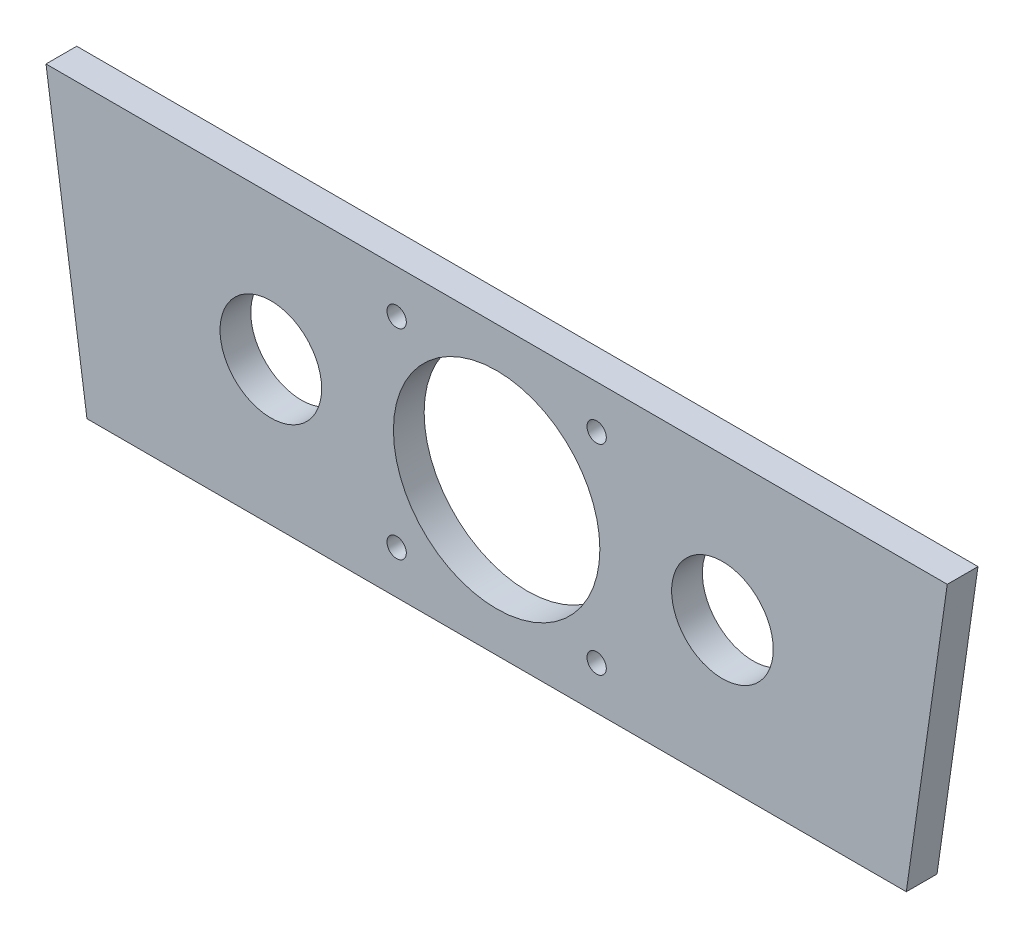
ISO-10303-21;
HEADER;
FILE_DESCRIPTION(('STEP AP214'),'2;1');
FILE_NAME('part.step','',(''),(''),'','','');
FILE_SCHEMA(('AUTOMOTIVE_DESIGN { 1 0 10303 214 1 1 1 1 }'));
ENDSEC;
DATA;
#1=APPLICATION_CONTEXT('core data for automotive mechanical design processes');
#2=APPLICATION_PROTOCOL_DEFINITION('international standard','automotive_design',2000,#1);
#3=PRODUCT_CONTEXT('',#1,'mechanical');
#4=PRODUCT('Part','Part','',(#3));
#5=PRODUCT_RELATED_PRODUCT_CATEGORY('part','',(#4));
#6=PRODUCT_DEFINITION_FORMATION('','',#4);
#7=PRODUCT_DEFINITION_CONTEXT('part definition',#1,'design');
#8=PRODUCT_DEFINITION('design','',#6,#7);
#9=PRODUCT_DEFINITION_SHAPE('','',#8);
#10=(LENGTH_UNIT() NAMED_UNIT(*) SI_UNIT(.MILLI.,.METRE.));
#11=(NAMED_UNIT(*) PLANE_ANGLE_UNIT() SI_UNIT($,.RADIAN.));
#12=(NAMED_UNIT(*) SI_UNIT($,.STERADIAN.) SOLID_ANGLE_UNIT());
#13=UNCERTAINTY_MEASURE_WITH_UNIT(LENGTH_MEASURE(1.E-05),#10,'distance_accuracy_value','');
#14=(GEOMETRIC_REPRESENTATION_CONTEXT(3) GLOBAL_UNCERTAINTY_ASSIGNED_CONTEXT((#13)) GLOBAL_UNIT_ASSIGNED_CONTEXT((#10,
#11,#12)) REPRESENTATION_CONTEXT('',''));
#15=CARTESIAN_POINT('',(0.,0.,0.));
#16=DIRECTION('',(0.,0.,1.));
#17=DIRECTION('',(1.,0.,0.));
#18=AXIS2_PLACEMENT_3D('',#15,#16,#17);
#19=CARTESIAN_POINT('',(0.,50.8,4.7625));
#20=DIRECTION('',(0.,1.,0.));
#21=DIRECTION('',(0.,0.,1.));
#22=AXIS2_PLACEMENT_3D('',#19,#20,#21);
#23=PLANE('',#22);
#24=DIRECTION('',(1.,0.,0.));
#25=VECTOR('',#24,1.);
#26=CARTESIAN_POINT('',(0.,50.8,0.));
#27=LINE('',#26,#25);
#28=CARTESIAN_POINT('',(6.34999999999998,50.8,0.));
#29=VERTEX_POINT('',#28);
#30=CARTESIAN_POINT('',(146.05,50.8,0.));
#31=VERTEX_POINT('',#30);
#32=EDGE_CURVE('E40',#29,#31,#27,.T.);
#33=ORIENTED_EDGE('',*,*,#32,.F.);
#34=DIRECTION('',(0.,0.,-1.));
#35=VECTOR('',#34,1.);
#36=CARTESIAN_POINT('',(6.34999999999998,50.8,165.406205136554));
#37=LINE('',#36,#35);
#38=CARTESIAN_POINT('',(6.34999999999998,50.8,4.7625));
#39=VERTEX_POINT('',#38);
#40=EDGE_CURVE('E92',#39,#29,#37,.T.);
#41=ORIENTED_EDGE('',*,*,#40,.F.);
#42=DIRECTION('',(-1.,0.,0.));
#43=VECTOR('',#42,1.);
#44=CARTESIAN_POINT('',(0.,50.8,4.7625));
#45=LINE('',#44,#43);
#46=CARTESIAN_POINT('',(146.05,50.8,4.7625));
#47=VERTEX_POINT('',#46);
#48=EDGE_CURVE('E11',#47,#39,#45,.T.);
#49=ORIENTED_EDGE('',*,*,#48,.F.);
#50=DIRECTION('',(0.,0.,-1.));
#51=VECTOR('',#50,1.);
#52=CARTESIAN_POINT('',(146.05,50.8,165.406205136554));
#53=LINE('',#52,#51);
#54=EDGE_CURVE('E75',#47,#31,#53,.T.);
#55=ORIENTED_EDGE('',*,*,#54,.T.);
#56=EDGE_LOOP('',(#33,#41,#49,#55));
#57=FACE_BOUND('',#56,.T.);
#58=ADVANCED_FACE('F37',(#57),#23,.T.);
#59=CARTESIAN_POINT('',(0.,0.,4.7625));
#60=DIRECTION('',(0.,0.,1.));
#61=DIRECTION('',(1.,0.,0.));
#62=AXIS2_PLACEMENT_3D('',#59,#60,#61);
#63=PLANE('',#62);
#64=CARTESIAN_POINT('',(91.7,13.075,4.7625));
#65=DIRECTION('',(0.,0.,1.));
#66=DIRECTION('',(1.,0.,0.));
#67=AXIS2_PLACEMENT_3D('',#64,#65,#66);
#68=CIRCLE('',#67,1.50000000000001);
#69=CARTESIAN_POINT('',(93.2,13.075,4.7625));
#70=VERTEX_POINT('',#69);
#71=EDGE_CURVE('E130',#70,#70,#68,.F.);
#72=ORIENTED_EDGE('',*,*,#71,.T.);
#73=EDGE_LOOP('',(#72));
#74=FACE_BOUND('',#73,.T.);
#75=CARTESIAN_POINT('',(60.7,13.075,4.7625));
#76=DIRECTION('',(0.,0.,1.));
#77=DIRECTION('',(1.,0.,0.));
#78=AXIS2_PLACEMENT_3D('',#75,#76,#77);
#79=CIRCLE('',#78,1.5);
#80=CARTESIAN_POINT('',(62.2,13.075,4.7625));
#81=VERTEX_POINT('',#80);
#82=EDGE_CURVE('E122',#81,#81,#79,.T.);
#83=ORIENTED_EDGE('',*,*,#82,.F.);
#84=EDGE_LOOP('',(#83));
#85=FACE_BOUND('',#84,.T.);
#86=CARTESIAN_POINT('',(60.7,44.075,4.7625));
#87=DIRECTION('',(0.,0.,1.));
#88=DIRECTION('',(1.,0.,0.));
#89=AXIS2_PLACEMENT_3D('',#86,#87,#88);
#90=CIRCLE('',#89,1.5);
#91=CARTESIAN_POINT('',(62.2,44.075,4.7625));
#92=VERTEX_POINT('',#91);
#93=EDGE_CURVE('E133',#92,#92,#90,.F.);
#94=ORIENTED_EDGE('',*,*,#93,.T.);
#95=EDGE_LOOP('',(#94));
#96=FACE_BOUND('',#95,.T.);
#97=CARTESIAN_POINT('',(41.2,28.575,4.7625));
#98=DIRECTION('',(0.,0.,1.));
#99=DIRECTION('',(1.,0.,0.));
#100=AXIS2_PLACEMENT_3D('',#97,#98,#99);
#101=CIRCLE('',#100,7.874);
#102=CARTESIAN_POINT('',(49.074,28.575,4.7625));
#103=VERTEX_POINT('',#102);
#104=EDGE_CURVE('E112',#103,#103,#101,.F.);
#105=ORIENTED_EDGE('',*,*,#104,.T.);
#106=EDGE_LOOP('',(#105));
#107=FACE_BOUND('',#106,.T.);
#108=CARTESIAN_POINT('',(91.7,44.075,4.7625));
#109=DIRECTION('',(0.,0.,1.));
#110=DIRECTION('',(1.,0.,0.));
#111=AXIS2_PLACEMENT_3D('',#108,#109,#110);
#112=CIRCLE('',#111,1.50000000000001);
#113=CARTESIAN_POINT('',(93.2,44.075,4.7625));
#114=VERTEX_POINT('',#113);
#115=EDGE_CURVE('E123',#114,#114,#112,.T.);
#116=ORIENTED_EDGE('',*,*,#115,.F.);
#117=EDGE_LOOP('',(#116));
#118=FACE_BOUND('',#117,.T.);
#119=CARTESIAN_POINT('',(76.2,28.575,4.7625));
#120=DIRECTION('',(0.,0.,1.));
#121=DIRECTION('',(1.,0.,0.));
#122=AXIS2_PLACEMENT_3D('',#119,#120,#121);
#123=CIRCLE('',#122,16.);
#124=CARTESIAN_POINT('',(92.2,28.575,4.7625));
#125=VERTEX_POINT('',#124);
#126=EDGE_CURVE('E140',#125,#125,#123,.T.);
#127=ORIENTED_EDGE('',*,*,#126,.F.);
#128=EDGE_LOOP('',(#127));
#129=FACE_BOUND('',#128,.T.);
#130=CARTESIAN_POINT('',(111.2,28.575,4.7625));
#131=DIRECTION('',(0.,0.,1.));
#132=DIRECTION('',(1.,0.,0.));
#133=AXIS2_PLACEMENT_3D('',#130,#131,#132);
#134=CIRCLE('',#133,7.874);
#135=CARTESIAN_POINT('',(119.074,28.575,4.7625));
#136=VERTEX_POINT('',#135);
#137=EDGE_CURVE('E83',#136,#136,#134,.T.);
#138=ORIENTED_EDGE('',*,*,#137,.F.);
#139=EDGE_LOOP('',(#138));
#140=FACE_BOUND('',#139,.T.);
#141=ORIENTED_EDGE('',*,*,#48,.T.);
#142=DIRECTION('',(-0.14142135623731,0.989949493661166,0.));
#143=VECTOR('',#142,1.);
#144=CARTESIAN_POINT('',(13.335,1.90500000000001,4.7625));
#145=LINE('',#144,#143);
#146=CARTESIAN_POINT('',(12.7,6.34999999999999,4.7625));
#147=VERTEX_POINT('',#146);
#148=EDGE_CURVE('E100',#147,#39,#145,.T.);
#149=ORIENTED_EDGE('',*,*,#148,.F.);
#150=DIRECTION('',(-1.,0.,0.));
#151=VECTOR('',#150,1.);
#152=CARTESIAN_POINT('',(0.,6.34999999999999,4.7625));
#153=LINE('',#152,#151);
#154=CARTESIAN_POINT('',(139.7,6.34999999999999,4.7625));
#155=VERTEX_POINT('',#154);
#156=EDGE_CURVE('E89',#155,#147,#153,.T.);
#157=ORIENTED_EDGE('',*,*,#156,.F.);
#158=DIRECTION('',(0.14142135623731,0.989949493661166,0.));
#159=VECTOR('',#158,1.);
#160=CARTESIAN_POINT('',(136.017,-19.4310000000001,4.7625));
#161=LINE('',#160,#159);
#162=EDGE_CURVE('E78',#155,#47,#161,.T.);
#163=ORIENTED_EDGE('',*,*,#162,.T.);
#164=EDGE_LOOP('',(#141,#149,#157,#163));
#165=FACE_BOUND('',#164,.T.);
#166=ADVANCED_FACE('F87',(#74,#85,#96,#107,#118,#129,#140,#165),#63,.T.);
#167=CARTESIAN_POINT('',(0.,0.,0.));
#168=DIRECTION('',(0.,0.,1.));
#169=DIRECTION('',(1.,0.,0.));
#170=AXIS2_PLACEMENT_3D('',#167,#168,#169);
#171=PLANE('',#170);
#172=CARTESIAN_POINT('',(41.2,28.575,0.));
#173=DIRECTION('',(0.,0.,1.));
#174=DIRECTION('',(1.,0.,0.));
#175=AXIS2_PLACEMENT_3D('',#172,#173,#174);
#176=CIRCLE('',#175,7.874);
#177=CARTESIAN_POINT('',(49.074,28.575,0.));
#178=VERTEX_POINT('',#177);
#179=EDGE_CURVE('E104',#178,#178,#176,.F.);
#180=ORIENTED_EDGE('',*,*,#179,.F.);
#181=EDGE_LOOP('',(#180));
#182=FACE_BOUND('',#181,.T.);
#183=CARTESIAN_POINT('',(111.2,28.575,0.));
#184=DIRECTION('',(0.,0.,1.));
#185=DIRECTION('',(1.,0.,0.));
#186=AXIS2_PLACEMENT_3D('',#183,#184,#185);
#187=CIRCLE('',#186,7.874);
#188=CARTESIAN_POINT('',(119.074,28.575,0.));
#189=VERTEX_POINT('',#188);
#190=EDGE_CURVE('E109',#189,#189,#187,.T.);
#191=ORIENTED_EDGE('',*,*,#190,.T.);
#192=EDGE_LOOP('',(#191));
#193=FACE_BOUND('',#192,.T.);
#194=CARTESIAN_POINT('',(76.2,28.575,0.));
#195=DIRECTION('',(0.,0.,1.));
#196=DIRECTION('',(1.,0.,0.));
#197=AXIS2_PLACEMENT_3D('',#194,#195,#196);
#198=CIRCLE('',#197,16.);
#199=CARTESIAN_POINT('',(92.2,28.575,0.));
#200=VERTEX_POINT('',#199);
#201=EDGE_CURVE('E113',#200,#200,#198,.T.);
#202=ORIENTED_EDGE('',*,*,#201,.T.);
#203=EDGE_LOOP('',(#202));
#204=FACE_BOUND('',#203,.T.);
#205=CARTESIAN_POINT('',(91.7,44.075,0.));
#206=DIRECTION('',(0.,0.,1.));
#207=DIRECTION('',(1.,0.,0.));
#208=AXIS2_PLACEMENT_3D('',#205,#206,#207);
#209=CIRCLE('',#208,1.50000000000001);
#210=CARTESIAN_POINT('',(93.2,44.075,0.));
#211=VERTEX_POINT('',#210);
#212=EDGE_CURVE('E116',#211,#211,#209,.T.);
#213=ORIENTED_EDGE('',*,*,#212,.T.);
#214=EDGE_LOOP('',(#213));
#215=FACE_BOUND('',#214,.T.);
#216=CARTESIAN_POINT('',(91.7,13.075,0.));
#217=DIRECTION('',(0.,0.,1.));
#218=DIRECTION('',(1.,0.,0.));
#219=AXIS2_PLACEMENT_3D('',#216,#217,#218);
#220=CIRCLE('',#219,1.50000000000001);
#221=CARTESIAN_POINT('',(93.2,13.075,0.));
#222=VERTEX_POINT('',#221);
#223=EDGE_CURVE('E119',#222,#222,#220,.F.);
#224=ORIENTED_EDGE('',*,*,#223,.F.);
#225=EDGE_LOOP('',(#224));
#226=FACE_BOUND('',#225,.T.);
#227=CARTESIAN_POINT('',(60.7,13.075,0.));
#228=DIRECTION('',(0.,0.,1.));
#229=DIRECTION('',(1.,0.,0.));
#230=AXIS2_PLACEMENT_3D('',#227,#228,#229);
#231=CIRCLE('',#230,1.5);
#232=CARTESIAN_POINT('',(62.2,13.075,0.));
#233=VERTEX_POINT('',#232);
#234=EDGE_CURVE('E107',#233,#233,#231,.T.);
#235=ORIENTED_EDGE('',*,*,#234,.T.);
#236=EDGE_LOOP('',(#235));
#237=FACE_BOUND('',#236,.T.);
#238=CARTESIAN_POINT('',(60.7,44.075,0.));
#239=DIRECTION('',(0.,0.,1.));
#240=DIRECTION('',(1.,0.,0.));
#241=AXIS2_PLACEMENT_3D('',#238,#239,#240);
#242=CIRCLE('',#241,1.5);
#243=CARTESIAN_POINT('',(62.2,44.075,0.));
#244=VERTEX_POINT('',#243);
#245=EDGE_CURVE('E108',#244,#244,#242,.F.);
#246=ORIENTED_EDGE('',*,*,#245,.F.);
#247=EDGE_LOOP('',(#246));
#248=FACE_BOUND('',#247,.T.);
#249=DIRECTION('',(-0.14142135623731,0.989949493661167,0.));
#250=VECTOR('',#249,1.);
#251=CARTESIAN_POINT('',(13.335,1.90500000000001,0.));
#252=LINE('',#251,#250);
#253=CARTESIAN_POINT('',(12.7,6.34999999999999,0.));
#254=VERTEX_POINT('',#253);
#255=EDGE_CURVE('E98',#254,#29,#252,.T.);
#256=ORIENTED_EDGE('',*,*,#255,.T.);
#257=ORIENTED_EDGE('',*,*,#32,.T.);
#258=DIRECTION('',(0.14142135623731,0.989949493661167,0.));
#259=VECTOR('',#258,1.);
#260=CARTESIAN_POINT('',(136.017,-19.4310000000001,0.));
#261=LINE('',#260,#259);
#262=CARTESIAN_POINT('',(139.7,6.34999999999998,0.));
#263=VERTEX_POINT('',#262);
#264=EDGE_CURVE('E59',#263,#31,#261,.T.);
#265=ORIENTED_EDGE('',*,*,#264,.F.);
#266=DIRECTION('',(-1.,0.,0.));
#267=VECTOR('',#266,1.);
#268=CARTESIAN_POINT('',(0.,6.34999999999999,0.));
#269=LINE('',#268,#267);
#270=EDGE_CURVE('E51',#263,#254,#269,.T.);
#271=ORIENTED_EDGE('',*,*,#270,.T.);
#272=EDGE_LOOP('',(#256,#257,#265,#271));
#273=FACE_BOUND('',#272,.T.);
#274=ADVANCED_FACE('F149',(#182,#193,#204,#215,#226,#237,#248,#273),#171,.F.);
#275=CARTESIAN_POINT('',(111.2,28.575,151.363634033813));
#276=DIRECTION('',(0.,0.,-1.));
#277=DIRECTION('',(-1.,0.,0.));
#278=AXIS2_PLACEMENT_3D('',#275,#276,#277);
#279=CYLINDRICAL_SURFACE('',#278,7.874);
#280=ORIENTED_EDGE('',*,*,#190,.F.);
#281=EDGE_LOOP('',(#280));
#282=FACE_BOUND('',#281,.T.);
#283=ORIENTED_EDGE('',*,*,#137,.T.);
#284=EDGE_LOOP('',(#283));
#285=FACE_BOUND('',#284,.T.);
#286=ADVANCED_FACE('F146',(#282,#285),#279,.F.);
#287=CARTESIAN_POINT('',(76.2,28.575,151.363634033813));
#288=DIRECTION('',(0.,0.,-1.));
#289=DIRECTION('',(-1.,0.,0.));
#290=AXIS2_PLACEMENT_3D('',#287,#288,#289);
#291=CYLINDRICAL_SURFACE('',#290,16.);
#292=ORIENTED_EDGE('',*,*,#201,.F.);
#293=EDGE_LOOP('',(#292));
#294=FACE_BOUND('',#293,.T.);
#295=ORIENTED_EDGE('',*,*,#126,.T.);
#296=EDGE_LOOP('',(#295));
#297=FACE_BOUND('',#296,.T.);
#298=ADVANCED_FACE('F179',(#294,#297),#291,.F.);
#299=CARTESIAN_POINT('',(91.7,44.075,151.363634033813));
#300=DIRECTION('',(0.,0.,-1.));
#301=DIRECTION('',(-1.,0.,0.));
#302=AXIS2_PLACEMENT_3D('',#299,#300,#301);
#303=CYLINDRICAL_SURFACE('',#302,1.50000000000001);
#304=ORIENTED_EDGE('',*,*,#212,.F.);
#305=EDGE_LOOP('',(#304));
#306=FACE_BOUND('',#305,.T.);
#307=ORIENTED_EDGE('',*,*,#115,.T.);
#308=EDGE_LOOP('',(#307));
#309=FACE_BOUND('',#308,.T.);
#310=ADVANCED_FACE('F175',(#306,#309),#303,.F.);
#311=CARTESIAN_POINT('',(91.7,13.075,151.363634033813));
#312=DIRECTION('',(0.,0.,-1.));
#313=DIRECTION('',(-1.,0.,0.));
#314=AXIS2_PLACEMENT_3D('',#311,#312,#313);
#315=CYLINDRICAL_SURFACE('',#314,1.50000000000001);
#316=ORIENTED_EDGE('',*,*,#223,.T.);
#317=EDGE_LOOP('',(#316));
#318=FACE_BOUND('',#317,.T.);
#319=ORIENTED_EDGE('',*,*,#71,.F.);
#320=EDGE_LOOP('',(#319));
#321=FACE_BOUND('',#320,.T.);
#322=ADVANCED_FACE('F171',(#318,#321),#315,.F.);
#323=CARTESIAN_POINT('',(60.7,13.075,151.363634033813));
#324=DIRECTION('',(0.,0.,-1.));
#325=DIRECTION('',(-1.,0.,0.));
#326=AXIS2_PLACEMENT_3D('',#323,#324,#325);
#327=CYLINDRICAL_SURFACE('',#326,1.5);
#328=ORIENTED_EDGE('',*,*,#234,.F.);
#329=EDGE_LOOP('',(#328));
#330=FACE_BOUND('',#329,.T.);
#331=ORIENTED_EDGE('',*,*,#82,.T.);
#332=EDGE_LOOP('',(#331));
#333=FACE_BOUND('',#332,.T.);
#334=ADVANCED_FACE('F167',(#330,#333),#327,.F.);
#335=CARTESIAN_POINT('',(60.7,44.075,151.363634033813));
#336=DIRECTION('',(0.,0.,-1.));
#337=DIRECTION('',(-1.,0.,0.));
#338=AXIS2_PLACEMENT_3D('',#335,#336,#337);
#339=CYLINDRICAL_SURFACE('',#338,1.5);
#340=ORIENTED_EDGE('',*,*,#245,.T.);
#341=EDGE_LOOP('',(#340));
#342=FACE_BOUND('',#341,.T.);
#343=ORIENTED_EDGE('',*,*,#93,.F.);
#344=EDGE_LOOP('',(#343));
#345=FACE_BOUND('',#344,.T.);
#346=ADVANCED_FACE('F163',(#342,#345),#339,.F.);
#347=CARTESIAN_POINT('',(41.2,28.575,151.363634033813));
#348=DIRECTION('',(0.,0.,-1.));
#349=DIRECTION('',(-1.,0.,0.));
#350=AXIS2_PLACEMENT_3D('',#347,#348,#349);
#351=CYLINDRICAL_SURFACE('',#350,7.874);
#352=ORIENTED_EDGE('',*,*,#179,.T.);
#353=EDGE_LOOP('',(#352));
#354=FACE_BOUND('',#353,.T.);
#355=ORIENTED_EDGE('',*,*,#104,.F.);
#356=EDGE_LOOP('',(#355));
#357=FACE_BOUND('',#356,.T.);
#358=ADVANCED_FACE('F159',(#354,#357),#351,.F.);
#359=CARTESIAN_POINT('',(13.335,1.90500000000001,165.406205136554));
#360=DIRECTION('',(-0.989949493661166,-0.14142135623731,0.));
#361=DIRECTION('',(0.14142135623731,-0.989949493661166,0.));
#362=AXIS2_PLACEMENT_3D('',#359,#360,#361);
#363=PLANE('',#362);
#364=ORIENTED_EDGE('',*,*,#148,.T.);
#365=ORIENTED_EDGE('',*,*,#40,.T.);
#366=ORIENTED_EDGE('',*,*,#255,.F.);
#367=DIRECTION('',(0.,0.,-1.));
#368=VECTOR('',#367,1.);
#369=CARTESIAN_POINT('',(12.7,6.34999999999999,165.406205136554));
#370=LINE('',#369,#368);
#371=EDGE_CURVE('E96',#147,#254,#370,.T.);
#372=ORIENTED_EDGE('',*,*,#371,.F.);
#373=EDGE_LOOP('',(#364,#365,#366,#372));
#374=FACE_BOUND('',#373,.T.);
#375=ADVANCED_FACE('F162',(#374),#363,.T.);
#376=CARTESIAN_POINT('',(0.,6.34999999999999,165.406205136554));
#377=DIRECTION('',(0.,-1.,0.));
#378=DIRECTION('',(0.,0.,-1.));
#379=AXIS2_PLACEMENT_3D('',#376,#377,#378);
#380=PLANE('',#379);
#381=ORIENTED_EDGE('',*,*,#156,.T.);
#382=ORIENTED_EDGE('',*,*,#371,.T.);
#383=ORIENTED_EDGE('',*,*,#270,.F.);
#384=DIRECTION('',(0.,0.,-1.));
#385=VECTOR('',#384,1.);
#386=CARTESIAN_POINT('',(139.7,6.34999999999999,165.406205136554));
#387=LINE('',#386,#385);
#388=EDGE_CURVE('E282',#155,#263,#387,.T.);
#389=ORIENTED_EDGE('',*,*,#388,.F.);
#390=EDGE_LOOP('',(#381,#382,#383,#389));
#391=FACE_BOUND('',#390,.T.);
#392=ADVANCED_FACE('F189',(#391),#380,.T.);
#393=CARTESIAN_POINT('',(136.017,-19.4310000000001,165.406205136554));
#394=DIRECTION('',(-0.989949493661166,0.14142135623731,0.));
#395=DIRECTION('',(-0.14142135623731,-0.989949493661166,0.));
#396=AXIS2_PLACEMENT_3D('',#393,#394,#395);
#397=PLANE('',#396);
#398=ORIENTED_EDGE('',*,*,#388,.T.);
#399=ORIENTED_EDGE('',*,*,#264,.T.);
#400=ORIENTED_EDGE('',*,*,#54,.F.);
#401=ORIENTED_EDGE('',*,*,#162,.F.);
#402=EDGE_LOOP('',(#398,#399,#400,#401));
#403=FACE_BOUND('',#402,.T.);
#404=ADVANCED_FACE('F77',(#403),#397,.F.);
#405=CLOSED_SHELL('',(#58,#166,#274,#286,#298,#310,#322,#334,#346,#358,#375,#392,#404));
#406=MANIFOLD_SOLID_BREP('B2',#405);
#407=ADVANCED_BREP_SHAPE_REPRESENTATION('',(#18,#406),#14);
#408=SHAPE_DEFINITION_REPRESENTATION(#9,#407);
ENDSEC;
END-ISO-10303-21;
